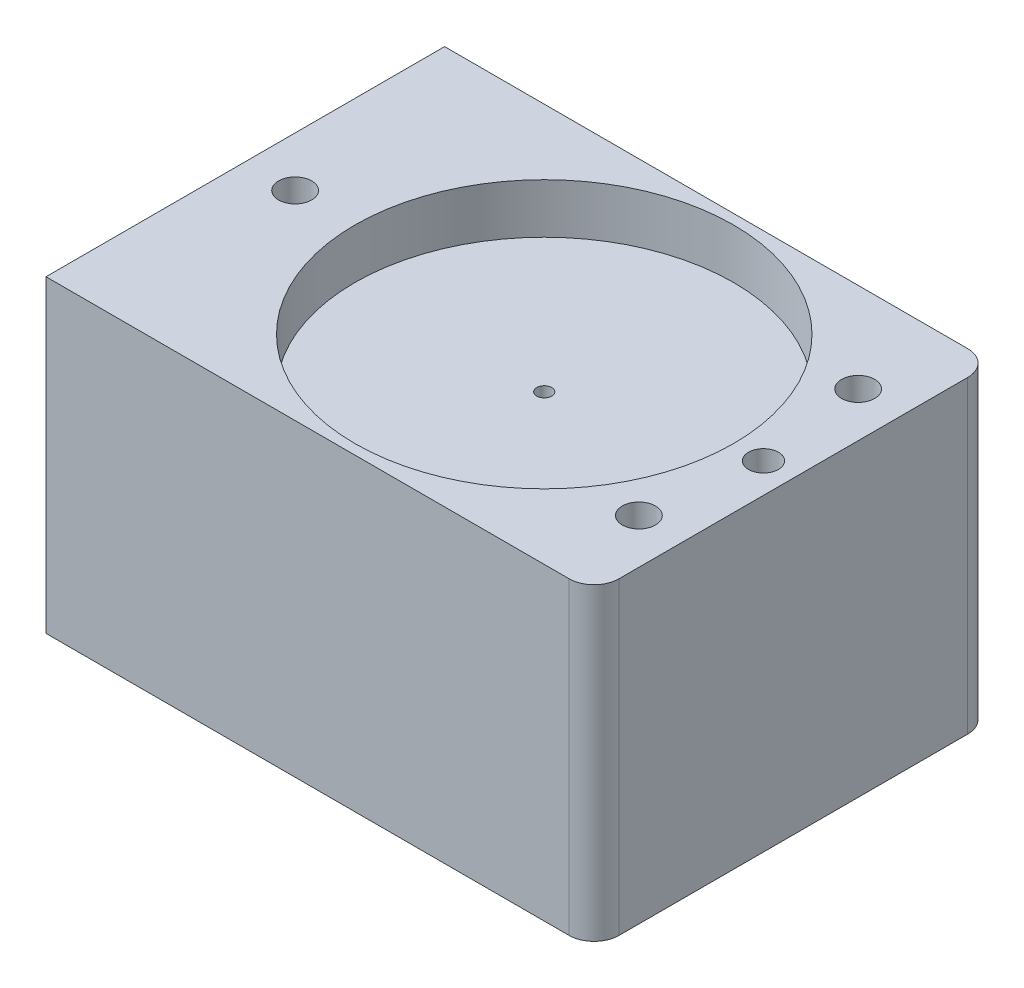
ISO-10303-21;
HEADER;
FILE_DESCRIPTION(('STEP AP214'),'2;1');
FILE_NAME('part.step','',(''),(''),'','','');
FILE_SCHEMA(('AUTOMOTIVE_DESIGN { 1 0 10303 214 1 1 1 1 }'));
ENDSEC;
DATA;
#1=APPLICATION_CONTEXT('core data for automotive mechanical design processes');
#2=APPLICATION_PROTOCOL_DEFINITION('international standard','automotive_design',2000,#1);
#3=PRODUCT_CONTEXT('',#1,'mechanical');
#4=PRODUCT('Part','Part','',(#3));
#5=PRODUCT_RELATED_PRODUCT_CATEGORY('part','',(#4));
#6=PRODUCT_DEFINITION_FORMATION('','',#4);
#7=PRODUCT_DEFINITION_CONTEXT('part definition',#1,'design');
#8=PRODUCT_DEFINITION('design','',#6,#7);
#9=PRODUCT_DEFINITION_SHAPE('','',#8);
#10=(LENGTH_UNIT() NAMED_UNIT(*) SI_UNIT(.MILLI.,.METRE.));
#11=(NAMED_UNIT(*) PLANE_ANGLE_UNIT() SI_UNIT($,.RADIAN.));
#12=(NAMED_UNIT(*) SI_UNIT($,.STERADIAN.) SOLID_ANGLE_UNIT());
#13=UNCERTAINTY_MEASURE_WITH_UNIT(LENGTH_MEASURE(1.E-05),#10,'distance_accuracy_value','');
#14=(GEOMETRIC_REPRESENTATION_CONTEXT(3) GLOBAL_UNCERTAINTY_ASSIGNED_CONTEXT((#13)) GLOBAL_UNIT_ASSIGNED_CONTEXT((#10,
#11,#12)) REPRESENTATION_CONTEXT('',''));
#15=CARTESIAN_POINT('',(0.,0.,0.));
#16=DIRECTION('',(0.,0.,1.));
#17=DIRECTION('',(1.,0.,0.));
#18=AXIS2_PLACEMENT_3D('',#15,#16,#17);
#19=CARTESIAN_POINT('',(-50.,0.,40.));
#20=DIRECTION('',(0.,1.,0.));
#21=DIRECTION('',(0.,0.,1.));
#22=AXIS2_PLACEMENT_3D('',#19,#20,#21);
#23=CYLINDRICAL_SURFACE('',#22,1.50000000000001);
#24=CARTESIAN_POINT('',(-50.,61.,40.));
#25=DIRECTION('',(0.,-1.,0.));
#26=DIRECTION('',(0.,0.,-1.));
#27=AXIS2_PLACEMENT_3D('',#24,#25,#26);
#28=CIRCLE('',#27,1.50000000000001);
#29=CARTESIAN_POINT('',(-50.,61.,38.5));
#30=VERTEX_POINT('',#29);
#31=EDGE_CURVE('E118',#30,#30,#28,.F.);
#32=ORIENTED_EDGE('',*,*,#31,.T.);
#33=EDGE_LOOP('',(#32));
#34=FACE_BOUND('',#33,.T.);
#35=CARTESIAN_POINT('',(-50.,19.,40.));
#36=DIRECTION('',(0.,-1.,0.));
#37=DIRECTION('',(0.,0.,-1.));
#38=AXIS2_PLACEMENT_3D('',#35,#36,#37);
#39=CIRCLE('',#38,1.50000000000001);
#40=CARTESIAN_POINT('',(-50.,19.,38.5));
#41=VERTEX_POINT('',#40);
#42=EDGE_CURVE('E35',#41,#41,#39,.F.);
#43=ORIENTED_EDGE('',*,*,#42,.F.);
#44=EDGE_LOOP('',(#43));
#45=FACE_BOUND('',#44,.T.);
#46=ADVANCED_FACE('F32',(#34,#45),#23,.F.);
#47=CARTESIAN_POINT('',(0.,80.,0.));
#48=DIRECTION('',(1.,0.,0.));
#49=DIRECTION('',(0.,0.,-1.));
#50=AXIS2_PLACEMENT_3D('',#47,#48,#49);
#51=PLANE('',#50);
#52=DIRECTION('',(0.,-1.,0.));
#53=VECTOR('',#52,1.);
#54=CARTESIAN_POINT('',(0.,60.,75.));
#55=LINE('',#54,#53);
#56=CARTESIAN_POINT('',(0.,9.,75.));
#57=VERTEX_POINT('',#56);
#58=CARTESIAN_POINT('',(0.,71.,75.));
#59=VERTEX_POINT('',#58);
#60=EDGE_CURVE('E105',#57,#59,#55,.F.);
#61=ORIENTED_EDGE('',*,*,#60,.F.);
#62=DIRECTION('',(0.,0.,1.));
#63=VECTOR('',#62,1.);
#64=CARTESIAN_POINT('',(0.,9.,0.));
#65=LINE('',#64,#63);
#66=CARTESIAN_POINT('',(0.,9.,5.));
#67=VERTEX_POINT('',#66);
#68=EDGE_CURVE('E98',#67,#57,#65,.T.);
#69=ORIENTED_EDGE('',*,*,#68,.F.);
#70=DIRECTION('',(0.,-1.,0.));
#71=VECTOR('',#70,1.);
#72=CARTESIAN_POINT('',(0.,60.,5.));
#73=LINE('',#72,#71);
#74=CARTESIAN_POINT('',(0.,71.,5.));
#75=VERTEX_POINT('',#74);
#76=EDGE_CURVE('E114',#75,#67,#73,.T.);
#77=ORIENTED_EDGE('',*,*,#76,.F.);
#78=DIRECTION('',(0.,0.,-1.));
#79=VECTOR('',#78,1.);
#80=CARTESIAN_POINT('',(0.,71.,0.));
#81=LINE('',#80,#79);
#82=EDGE_CURVE('E134',#59,#75,#81,.T.);
#83=ORIENTED_EDGE('',*,*,#82,.F.);
#84=EDGE_LOOP('',(#61,#69,#77,#83));
#85=FACE_BOUND('',#84,.T.);
#86=ADVANCED_FACE('F238',(#85),#51,.T.);
#87=CARTESIAN_POINT('',(-55.,40.,0.));
#88=DIRECTION('',(0.,0.,1.));
#89=DIRECTION('',(1.,0.,0.));
#90=AXIS2_PLACEMENT_3D('',#87,#88,#89);
#91=PLANE('',#90);
#92=DIRECTION('',(1.,0.,0.));
#93=VECTOR('',#92,1.);
#94=CARTESIAN_POINT('',(-110.,9.,0.));
#95=LINE('',#94,#93);
#96=CARTESIAN_POINT('',(-110.,9.,0.));
#97=VERTEX_POINT('',#96);
#98=CARTESIAN_POINT('',(-5.00000000000001,9.,0.));
#99=VERTEX_POINT('',#98);
#100=EDGE_CURVE('E87',#97,#99,#95,.T.);
#101=ORIENTED_EDGE('',*,*,#100,.F.);
#102=DIRECTION('',(0.,1.,0.));
#103=VECTOR('',#102,1.);
#104=CARTESIAN_POINT('',(-110.,0.,0.));
#105=LINE('',#104,#103);
#106=CARTESIAN_POINT('',(-110.,71.,0.));
#107=VERTEX_POINT('',#106);
#108=EDGE_CURVE('E40',#107,#97,#105,.F.);
#109=ORIENTED_EDGE('',*,*,#108,.F.);
#110=DIRECTION('',(-1.,0.,0.));
#111=VECTOR('',#110,1.);
#112=CARTESIAN_POINT('',(-110.,71.,0.));
#113=LINE('',#112,#111);
#114=CARTESIAN_POINT('',(-5.00000000000003,71.,0.));
#115=VERTEX_POINT('',#114);
#116=EDGE_CURVE('E56',#115,#107,#113,.T.);
#117=ORIENTED_EDGE('',*,*,#116,.F.);
#118=DIRECTION('',(0.,-1.,0.));
#119=VECTOR('',#118,1.);
#120=CARTESIAN_POINT('',(-5.00000000000002,60.,0.));
#121=LINE('',#120,#119);
#122=EDGE_CURVE('E97',#99,#115,#121,.F.);
#123=ORIENTED_EDGE('',*,*,#122,.F.);
#124=EDGE_LOOP('',(#101,#109,#117,#123));
#125=FACE_BOUND('',#124,.T.);
#126=ADVANCED_FACE('F96',(#125),#91,.F.);
#127=CARTESIAN_POINT('',(-55.,40.,80.));
#128=DIRECTION('',(0.,0.,1.));
#129=DIRECTION('',(1.,0.,0.));
#130=AXIS2_PLACEMENT_3D('',#127,#128,#129);
#131=PLANE('',#130);
#132=DIRECTION('',(0.,1.,0.));
#133=VECTOR('',#132,1.);
#134=CARTESIAN_POINT('',(-110.,0.,80.));
#135=LINE('',#134,#133);
#136=CARTESIAN_POINT('',(-110.,9.,80.));
#137=VERTEX_POINT('',#136);
#138=CARTESIAN_POINT('',(-110.,71.,80.));
#139=VERTEX_POINT('',#138);
#140=EDGE_CURVE('E11',#137,#139,#135,.T.);
#141=ORIENTED_EDGE('',*,*,#140,.F.);
#142=DIRECTION('',(-1.,0.,0.));
#143=VECTOR('',#142,1.);
#144=CARTESIAN_POINT('',(0.,9.,80.));
#145=LINE('',#144,#143);
#146=CARTESIAN_POINT('',(-5.00000000000001,9.,80.));
#147=VERTEX_POINT('',#146);
#148=EDGE_CURVE('E48',#147,#137,#145,.T.);
#149=ORIENTED_EDGE('',*,*,#148,.F.);
#150=DIRECTION('',(0.,-1.,0.));
#151=VECTOR('',#150,1.);
#152=CARTESIAN_POINT('',(-5.00000000000002,60.,80.));
#153=LINE('',#152,#151);
#154=CARTESIAN_POINT('',(-5.00000000000003,71.,80.));
#155=VERTEX_POINT('',#154);
#156=EDGE_CURVE('E102',#155,#147,#153,.T.);
#157=ORIENTED_EDGE('',*,*,#156,.F.);
#158=DIRECTION('',(1.,0.,0.));
#159=VECTOR('',#158,1.);
#160=CARTESIAN_POINT('',(-110.,71.,80.));
#161=LINE('',#160,#159);
#162=EDGE_CURVE('E136',#139,#155,#161,.T.);
#163=ORIENTED_EDGE('',*,*,#162,.F.);
#164=EDGE_LOOP('',(#141,#149,#157,#163));
#165=FACE_BOUND('',#164,.T.);
#166=ADVANCED_FACE('F349',(#165),#131,.T.);
#167=CARTESIAN_POINT('',(-5.00000000000002,60.,5.));
#168=DIRECTION('',(0.,-1.,0.));
#169=DIRECTION('',(1.,0.,0.));
#170=AXIS2_PLACEMENT_3D('',#167,#168,#169);
#171=CYLINDRICAL_SURFACE('',#170,5.);
#172=ORIENTED_EDGE('',*,*,#76,.T.);
#173=CARTESIAN_POINT('',(-5.00000000000001,9.,5.));
#174=DIRECTION('',(0.,-1.,0.));
#175=DIRECTION('',(0.,0.,-1.));
#176=AXIS2_PLACEMENT_3D('',#173,#174,#175);
#177=CIRCLE('',#176,5.);
#178=EDGE_CURVE('E165',#67,#99,#177,.F.);
#179=ORIENTED_EDGE('',*,*,#178,.T.);
#180=ORIENTED_EDGE('',*,*,#122,.T.);
#181=CARTESIAN_POINT('',(-5.00000000000003,71.,5.));
#182=DIRECTION('',(0.,1.,0.));
#183=DIRECTION('',(0.,0.,1.));
#184=AXIS2_PLACEMENT_3D('',#181,#182,#183);
#185=CIRCLE('',#184,5.);
#186=EDGE_CURVE('E125',#115,#75,#185,.F.);
#187=ORIENTED_EDGE('',*,*,#186,.T.);
#188=EDGE_LOOP('',(#172,#179,#180,#187));
#189=FACE_BOUND('',#188,.T.);
#190=ADVANCED_FACE('F357',(#189),#171,.T.);
#191=CARTESIAN_POINT('',(-5.00000000000002,60.,75.));
#192=DIRECTION('',(0.,-1.,0.));
#193=DIRECTION('',(1.,0.,0.));
#194=AXIS2_PLACEMENT_3D('',#191,#192,#193);
#195=CYLINDRICAL_SURFACE('',#194,5.);
#196=ORIENTED_EDGE('',*,*,#156,.T.);
#197=CARTESIAN_POINT('',(-5.00000000000001,9.,75.));
#198=DIRECTION('',(0.,-1.,0.));
#199=DIRECTION('',(0.,0.,-1.));
#200=AXIS2_PLACEMENT_3D('',#197,#198,#199);
#201=CIRCLE('',#200,5.);
#202=EDGE_CURVE('E169',#147,#57,#201,.F.);
#203=ORIENTED_EDGE('',*,*,#202,.T.);
#204=ORIENTED_EDGE('',*,*,#60,.T.);
#205=CARTESIAN_POINT('',(-5.00000000000003,71.,75.));
#206=DIRECTION('',(0.,1.,0.));
#207=DIRECTION('',(0.,0.,1.));
#208=AXIS2_PLACEMENT_3D('',#205,#206,#207);
#209=CIRCLE('',#208,5.);
#210=EDGE_CURVE('E128',#59,#155,#209,.F.);
#211=ORIENTED_EDGE('',*,*,#210,.T.);
#212=EDGE_LOOP('',(#196,#203,#204,#211));
#213=FACE_BOUND('',#212,.T.);
#214=ADVANCED_FACE('F366',(#213),#195,.T.);
#215=CARTESIAN_POINT('',(-110.,0.,0.));
#216=DIRECTION('',(-1.,0.,0.));
#217=DIRECTION('',(0.,0.,1.));
#218=AXIS2_PLACEMENT_3D('',#215,#216,#217);
#219=PLANE('',#218);
#220=ORIENTED_EDGE('',*,*,#108,.T.);
#221=DIRECTION('',(0.,0.,-1.));
#222=VECTOR('',#221,1.);
#223=CARTESIAN_POINT('',(-110.,9.,80.));
#224=LINE('',#223,#222);
#225=EDGE_CURVE('E84',#137,#97,#224,.T.);
#226=ORIENTED_EDGE('',*,*,#225,.F.);
#227=ORIENTED_EDGE('',*,*,#140,.T.);
#228=DIRECTION('',(0.,0.,1.));
#229=VECTOR('',#228,1.);
#230=CARTESIAN_POINT('',(-110.,71.,0.));
#231=LINE('',#230,#229);
#232=EDGE_CURVE('E101',#107,#139,#231,.T.);
#233=ORIENTED_EDGE('',*,*,#232,.F.);
#234=EDGE_LOOP('',(#220,#226,#227,#233));
#235=FACE_BOUND('',#234,.T.);
#236=ADVANCED_FACE('F100',(#235),#219,.T.);
#237=CARTESIAN_POINT('',(0.,71.,0.));
#238=DIRECTION('',(0.,1.,0.));
#239=DIRECTION('',(0.,0.,1.));
#240=AXIS2_PLACEMENT_3D('',#237,#238,#239);
#241=PLANE('',#240);
#242=CARTESIAN_POINT('',(-50.,71.,40.));
#243=DIRECTION('',(0.,-1.,0.));
#244=DIRECTION('',(0.,0.,-1.));
#245=AXIS2_PLACEMENT_3D('',#242,#243,#244);
#246=CIRCLE('',#245,38.0000000000006);
#247=CARTESIAN_POINT('',(-50.,71.,1.99999999999934));
#248=VERTEX_POINT('',#247);
#249=EDGE_CURVE('E162',#248,#248,#246,.T.);
#250=ORIENTED_EDGE('',*,*,#249,.T.);
#251=EDGE_LOOP('',(#250));
#252=FACE_BOUND('',#251,.T.);
#253=CARTESIAN_POINT('',(-9.00000000000002,71.,18.));
#254=DIRECTION('',(0.,1.,0.));
#255=DIRECTION('',(0.,0.,1.));
#256=AXIS2_PLACEMENT_3D('',#253,#254,#255);
#257=CIRCLE('',#256,3.3235);
#258=CARTESIAN_POINT('',(-9.00000000000002,71.,21.3235));
#259=VERTEX_POINT('',#258);
#260=EDGE_CURVE('E157',#259,#259,#257,.T.);
#261=ORIENTED_EDGE('',*,*,#260,.F.);
#262=EDGE_LOOP('',(#261));
#263=FACE_BOUND('',#262,.T.);
#264=CARTESIAN_POINT('',(-9.00000000000002,71.,62.));
#265=DIRECTION('',(0.,1.,0.));
#266=DIRECTION('',(0.,0.,1.));
#267=AXIS2_PLACEMENT_3D('',#264,#265,#266);
#268=CIRCLE('',#267,3.3235);
#269=CARTESIAN_POINT('',(-9.00000000000002,71.,65.3235));
#270=VERTEX_POINT('',#269);
#271=EDGE_CURVE('E151',#270,#270,#268,.T.);
#272=ORIENTED_EDGE('',*,*,#271,.F.);
#273=EDGE_LOOP('',(#272));
#274=FACE_BOUND('',#273,.T.);
#275=CARTESIAN_POINT('',(-6.00000000000002,71.,40.));
#276=DIRECTION('',(0.,1.,0.));
#277=DIRECTION('',(0.,0.,1.));
#278=AXIS2_PLACEMENT_3D('',#275,#276,#277);
#279=CIRCLE('',#278,2.99999999999999);
#280=CARTESIAN_POINT('',(-6.00000000000002,71.,43.));
#281=VERTEX_POINT('',#280);
#282=EDGE_CURVE('E121',#281,#281,#279,.T.);
#283=ORIENTED_EDGE('',*,*,#282,.F.);
#284=EDGE_LOOP('',(#283));
#285=FACE_BOUND('',#284,.T.);
#286=CARTESIAN_POINT('',(-100.,71.,40.));
#287=DIRECTION('',(0.,1.,0.));
#288=DIRECTION('',(0.,0.,1.));
#289=AXIS2_PLACEMENT_3D('',#286,#287,#288);
#290=CIRCLE('',#289,3.32350000000001);
#291=CARTESIAN_POINT('',(-100.,71.,43.3235));
#292=VERTEX_POINT('',#291);
#293=EDGE_CURVE('E140',#292,#292,#290,.T.);
#294=ORIENTED_EDGE('',*,*,#293,.F.);
#295=EDGE_LOOP('',(#294));
#296=FACE_BOUND('',#295,.T.);
#297=ORIENTED_EDGE('',*,*,#116,.T.);
#298=ORIENTED_EDGE('',*,*,#232,.T.);
#299=ORIENTED_EDGE('',*,*,#162,.T.);
#300=ORIENTED_EDGE('',*,*,#210,.F.);
#301=ORIENTED_EDGE('',*,*,#82,.T.);
#302=ORIENTED_EDGE('',*,*,#186,.F.);
#303=EDGE_LOOP('',(#297,#298,#299,#300,#301,#302));
#304=FACE_BOUND('',#303,.T.);
#305=ADVANCED_FACE('F381',(#252,#263,#274,#285,#296,#304),#241,.T.);
#306=CARTESIAN_POINT('',(-100.,56.,40.));
#307=DIRECTION('',(0.,1.,0.));
#308=DIRECTION('',(0.,0.,1.));
#309=AXIS2_PLACEMENT_3D('',#306,#307,#308);
#310=CYLINDRICAL_SURFACE('',#309,3.32350000000001);
#311=CARTESIAN_POINT('',(-100.,56.,40.));
#312=DIRECTION('',(0.,1.,0.));
#313=DIRECTION('',(0.,0.,1.));
#314=AXIS2_PLACEMENT_3D('',#311,#312,#313);
#315=CIRCLE('',#314,3.32350000000001);
#316=CARTESIAN_POINT('',(-100.,56.,43.3235));
#317=VERTEX_POINT('',#316);
#318=EDGE_CURVE('E139',#317,#317,#315,.T.);
#319=ORIENTED_EDGE('',*,*,#318,.F.);
#320=EDGE_LOOP('',(#319));
#321=FACE_BOUND('',#320,.T.);
#322=ORIENTED_EDGE('',*,*,#293,.T.);
#323=EDGE_LOOP('',(#322));
#324=FACE_BOUND('',#323,.T.);
#325=ADVANCED_FACE('F461',(#321,#324),#310,.F.);
#326=CARTESIAN_POINT('',(-100.,56.,40.));
#327=DIRECTION('',(0.,1.,0.));
#328=DIRECTION('',(0.,0.,1.));
#329=AXIS2_PLACEMENT_3D('',#326,#327,#328);
#330=PLANE('',#329);
#331=ORIENTED_EDGE('',*,*,#318,.T.);
#332=EDGE_LOOP('',(#331));
#333=FACE_BOUND('',#332,.T.);
#334=ADVANCED_FACE('F452',(#333),#330,.T.);
#335=CARTESIAN_POINT('',(-6.00000000000002,56.,40.));
#336=DIRECTION('',(0.,1.,0.));
#337=DIRECTION('',(0.,0.,1.));
#338=AXIS2_PLACEMENT_3D('',#335,#336,#337);
#339=CYLINDRICAL_SURFACE('',#338,2.99999999999999);
#340=CARTESIAN_POINT('',(-6.00000000000002,56.,40.));
#341=DIRECTION('',(0.,1.,0.));
#342=DIRECTION('',(0.,0.,1.));
#343=AXIS2_PLACEMENT_3D('',#340,#341,#342);
#344=CIRCLE('',#343,2.99999999999999);
#345=CARTESIAN_POINT('',(-6.00000000000002,56.,43.));
#346=VERTEX_POINT('',#345);
#347=EDGE_CURVE('E148',#346,#346,#344,.T.);
#348=ORIENTED_EDGE('',*,*,#347,.F.);
#349=EDGE_LOOP('',(#348));
#350=FACE_BOUND('',#349,.T.);
#351=ORIENTED_EDGE('',*,*,#282,.T.);
#352=EDGE_LOOP('',(#351));
#353=FACE_BOUND('',#352,.T.);
#354=ADVANCED_FACE('F443',(#350,#353),#339,.F.);
#355=CARTESIAN_POINT('',(-6.00000000000002,56.,40.));
#356=DIRECTION('',(0.,1.,0.));
#357=DIRECTION('',(0.,0.,1.));
#358=AXIS2_PLACEMENT_3D('',#355,#356,#357);
#359=PLANE('',#358);
#360=ORIENTED_EDGE('',*,*,#347,.T.);
#361=EDGE_LOOP('',(#360));
#362=FACE_BOUND('',#361,.T.);
#363=ADVANCED_FACE('F434',(#362),#359,.T.);
#364=CARTESIAN_POINT('',(-9.00000000000002,56.,62.));
#365=DIRECTION('',(0.,1.,0.));
#366=DIRECTION('',(0.,0.,1.));
#367=AXIS2_PLACEMENT_3D('',#364,#365,#366);
#368=CYLINDRICAL_SURFACE('',#367,3.3235);
#369=CARTESIAN_POINT('',(-9.00000000000002,56.,62.));
#370=DIRECTION('',(0.,1.,0.));
#371=DIRECTION('',(0.,0.,1.));
#372=AXIS2_PLACEMENT_3D('',#369,#370,#371);
#373=CIRCLE('',#372,3.3235);
#374=CARTESIAN_POINT('',(-9.00000000000002,56.,65.3235));
#375=VERTEX_POINT('',#374);
#376=EDGE_CURVE('E154',#375,#375,#373,.T.);
#377=ORIENTED_EDGE('',*,*,#376,.F.);
#378=EDGE_LOOP('',(#377));
#379=FACE_BOUND('',#378,.T.);
#380=ORIENTED_EDGE('',*,*,#271,.T.);
#381=EDGE_LOOP('',(#380));
#382=FACE_BOUND('',#381,.T.);
#383=ADVANCED_FACE('F425',(#379,#382),#368,.F.);
#384=CARTESIAN_POINT('',(-9.00000000000002,56.,62.));
#385=DIRECTION('',(0.,1.,0.));
#386=DIRECTION('',(0.,0.,1.));
#387=AXIS2_PLACEMENT_3D('',#384,#385,#386);
#388=PLANE('',#387);
#389=ORIENTED_EDGE('',*,*,#376,.T.);
#390=EDGE_LOOP('',(#389));
#391=FACE_BOUND('',#390,.T.);
#392=ADVANCED_FACE('F416',(#391),#388,.T.);
#393=CARTESIAN_POINT('',(-9.00000000000002,56.,18.));
#394=DIRECTION('',(0.,1.,0.));
#395=DIRECTION('',(0.,0.,1.));
#396=AXIS2_PLACEMENT_3D('',#393,#394,#395);
#397=CYLINDRICAL_SURFACE('',#396,3.3235);
#398=CARTESIAN_POINT('',(-9.00000000000002,56.,18.));
#399=DIRECTION('',(0.,1.,0.));
#400=DIRECTION('',(0.,0.,1.));
#401=AXIS2_PLACEMENT_3D('',#398,#399,#400);
#402=CIRCLE('',#401,3.3235);
#403=CARTESIAN_POINT('',(-9.00000000000002,56.,21.3235));
#404=VERTEX_POINT('',#403);
#405=EDGE_CURVE('E143',#404,#404,#402,.T.);
#406=ORIENTED_EDGE('',*,*,#405,.F.);
#407=EDGE_LOOP('',(#406));
#408=FACE_BOUND('',#407,.T.);
#409=ORIENTED_EDGE('',*,*,#260,.T.);
#410=EDGE_LOOP('',(#409));
#411=FACE_BOUND('',#410,.T.);
#412=ADVANCED_FACE('F407',(#408,#411),#397,.F.);
#413=CARTESIAN_POINT('',(-9.00000000000002,56.,18.));
#414=DIRECTION('',(0.,1.,0.));
#415=DIRECTION('',(0.,0.,1.));
#416=AXIS2_PLACEMENT_3D('',#413,#414,#415);
#417=PLANE('',#416);
#418=ORIENTED_EDGE('',*,*,#405,.T.);
#419=EDGE_LOOP('',(#418));
#420=FACE_BOUND('',#419,.T.);
#421=ADVANCED_FACE('F397',(#420),#417,.T.);
#422=CARTESIAN_POINT('',(-50.,61.,40.));
#423=DIRECTION('',(0.,-1.,0.));
#424=DIRECTION('',(0.,0.,-1.));
#425=AXIS2_PLACEMENT_3D('',#422,#423,#424);
#426=PLANE('',#425);
#427=CARTESIAN_POINT('',(-50.,61.,40.));
#428=DIRECTION('',(0.,-1.,0.));
#429=DIRECTION('',(0.,0.,-1.));
#430=AXIS2_PLACEMENT_3D('',#427,#428,#429);
#431=CIRCLE('',#430,38.0000000000006);
#432=CARTESIAN_POINT('',(-50.,61.,1.99999999999934));
#433=VERTEX_POINT('',#432);
#434=EDGE_CURVE('E122',#433,#433,#431,.T.);
#435=ORIENTED_EDGE('',*,*,#434,.F.);
#436=EDGE_LOOP('',(#435));
#437=FACE_BOUND('',#436,.T.);
#438=ORIENTED_EDGE('',*,*,#31,.F.);
#439=EDGE_LOOP('',(#438));
#440=FACE_BOUND('',#439,.T.);
#441=ADVANCED_FACE('F388',(#437,#440),#426,.F.);
#442=CARTESIAN_POINT('',(-50.,61.,40.));
#443=DIRECTION('',(0.,1.,0.));
#444=DIRECTION('',(0.,0.,1.));
#445=AXIS2_PLACEMENT_3D('',#442,#443,#444);
#446=CYLINDRICAL_SURFACE('',#445,38.0000000000006);
#447=ORIENTED_EDGE('',*,*,#434,.T.);
#448=EDGE_LOOP('',(#447));
#449=FACE_BOUND('',#448,.T.);
#450=ORIENTED_EDGE('',*,*,#249,.F.);
#451=EDGE_LOOP('',(#450));
#452=FACE_BOUND('',#451,.T.);
#453=ADVANCED_FACE('F217',(#449,#452),#446,.F.);
#454=CARTESIAN_POINT('',(0.,9.,0.));
#455=DIRECTION('',(0.,-1.,0.));
#456=DIRECTION('',(0.,0.,-1.));
#457=AXIS2_PLACEMENT_3D('',#454,#455,#456);
#458=PLANE('',#457);
#459=CARTESIAN_POINT('',(-8.99999999999999,9.,17.9999999999999));
#460=DIRECTION('',(0.,-1.,0.));
#461=DIRECTION('',(0.,0.,-1.));
#462=AXIS2_PLACEMENT_3D('',#459,#460,#461);
#463=CIRCLE('',#462,3.32349999999999);
#464=CARTESIAN_POINT('',(-8.99999999999999,9.,14.6765));
#465=VERTEX_POINT('',#464);
#466=EDGE_CURVE('E193',#465,#465,#463,.T.);
#467=ORIENTED_EDGE('',*,*,#466,.F.);
#468=EDGE_LOOP('',(#467));
#469=FACE_BOUND('',#468,.T.);
#470=CARTESIAN_POINT('',(-5.99999999999998,9.,39.9999999999999));
#471=DIRECTION('',(0.,-1.,0.));
#472=DIRECTION('',(0.,0.,-1.));
#473=AXIS2_PLACEMENT_3D('',#470,#471,#472);
#474=CIRCLE('',#473,2.99999999999999);
#475=CARTESIAN_POINT('',(-5.99999999999998,9.,37.));
#476=VERTEX_POINT('',#475);
#477=EDGE_CURVE('E199',#476,#476,#474,.T.);
#478=ORIENTED_EDGE('',*,*,#477,.F.);
#479=EDGE_LOOP('',(#478));
#480=FACE_BOUND('',#479,.T.);
#481=CARTESIAN_POINT('',(-50.,9.,40.));
#482=DIRECTION('',(0.,-1.,0.));
#483=DIRECTION('',(0.,0.,-1.));
#484=AXIS2_PLACEMENT_3D('',#481,#482,#483);
#485=CIRCLE('',#484,38.0000000000006);
#486=CARTESIAN_POINT('',(-50.,9.,1.99999999999934));
#487=VERTEX_POINT('',#486);
#488=EDGE_CURVE('E180',#487,#487,#485,.T.);
#489=ORIENTED_EDGE('',*,*,#488,.F.);
#490=EDGE_LOOP('',(#489));
#491=FACE_BOUND('',#490,.T.);
#492=CARTESIAN_POINT('',(-8.99999999999997,9.,61.9999999999999));
#493=DIRECTION('',(0.,-1.,0.));
#494=DIRECTION('',(0.,0.,-1.));
#495=AXIS2_PLACEMENT_3D('',#492,#493,#494);
#496=CIRCLE('',#495,3.3235);
#497=CARTESIAN_POINT('',(-8.99999999999997,9.,58.6764999999999));
#498=VERTEX_POINT('',#497);
#499=EDGE_CURVE('E187',#498,#498,#496,.T.);
#500=ORIENTED_EDGE('',*,*,#499,.F.);
#501=EDGE_LOOP('',(#500));
#502=FACE_BOUND('',#501,.T.);
#503=CARTESIAN_POINT('',(-100.,9.,40.));
#504=DIRECTION('',(0.,-1.,0.));
#505=DIRECTION('',(0.,0.,-1.));
#506=AXIS2_PLACEMENT_3D('',#503,#504,#505);
#507=CIRCLE('',#506,3.32350000000002);
#508=CARTESIAN_POINT('',(-100.,9.,36.6765));
#509=VERTEX_POINT('',#508);
#510=EDGE_CURVE('E175',#509,#509,#507,.T.);
#511=ORIENTED_EDGE('',*,*,#510,.F.);
#512=EDGE_LOOP('',(#511));
#513=FACE_BOUND('',#512,.T.);
#514=ORIENTED_EDGE('',*,*,#68,.T.);
#515=ORIENTED_EDGE('',*,*,#202,.F.);
#516=ORIENTED_EDGE('',*,*,#148,.T.);
#517=ORIENTED_EDGE('',*,*,#225,.T.);
#518=ORIENTED_EDGE('',*,*,#100,.T.);
#519=ORIENTED_EDGE('',*,*,#178,.F.);
#520=EDGE_LOOP('',(#514,#515,#516,#517,#518,#519));
#521=FACE_BOUND('',#520,.T.);
#522=ADVANCED_FACE('F86',(#469,#480,#491,#502,#513,#521),#458,.T.);
#523=CARTESIAN_POINT('',(-100.,19.,40.));
#524=DIRECTION('',(0.,-1.,0.));
#525=DIRECTION('',(0.,0.,-1.));
#526=AXIS2_PLACEMENT_3D('',#523,#524,#525);
#527=CYLINDRICAL_SURFACE('',#526,3.32350000000002);
#528=CARTESIAN_POINT('',(-100.,19.,40.));
#529=DIRECTION('',(0.,-1.,0.));
#530=DIRECTION('',(0.,0.,-1.));
#531=AXIS2_PLACEMENT_3D('',#528,#529,#530);
#532=CIRCLE('',#531,3.32350000000002);
#533=CARTESIAN_POINT('',(-100.,19.,36.6765));
#534=VERTEX_POINT('',#533);
#535=EDGE_CURVE('E174',#534,#534,#532,.T.);
#536=ORIENTED_EDGE('',*,*,#535,.F.);
#537=EDGE_LOOP('',(#536));
#538=FACE_BOUND('',#537,.T.);
#539=ORIENTED_EDGE('',*,*,#510,.T.);
#540=EDGE_LOOP('',(#539));
#541=FACE_BOUND('',#540,.T.);
#542=ADVANCED_FACE('F216',(#538,#541),#527,.F.);
#543=CARTESIAN_POINT('',(-100.,19.,40.));
#544=DIRECTION('',(0.,-1.,0.));
#545=DIRECTION('',(0.,0.,-1.));
#546=AXIS2_PLACEMENT_3D('',#543,#544,#545);
#547=PLANE('',#546);
#548=ORIENTED_EDGE('',*,*,#535,.T.);
#549=EDGE_LOOP('',(#548));
#550=FACE_BOUND('',#549,.T.);
#551=ADVANCED_FACE('F227',(#550),#547,.T.);
#552=CARTESIAN_POINT('',(-8.99999999999997,19.,61.9999999999999));
#553=DIRECTION('',(0.,-1.,0.));
#554=DIRECTION('',(0.,0.,-1.));
#555=AXIS2_PLACEMENT_3D('',#552,#553,#554);
#556=CYLINDRICAL_SURFACE('',#555,3.3235);
#557=CARTESIAN_POINT('',(-8.99999999999997,19.,61.9999999999999));
#558=DIRECTION('',(0.,-1.,0.));
#559=DIRECTION('',(0.,0.,-1.));
#560=AXIS2_PLACEMENT_3D('',#557,#558,#559);
#561=CIRCLE('',#560,3.3235);
#562=CARTESIAN_POINT('',(-8.99999999999997,19.,58.6764999999999));
#563=VERTEX_POINT('',#562);
#564=EDGE_CURVE('E184',#563,#563,#561,.T.);
#565=ORIENTED_EDGE('',*,*,#564,.F.);
#566=EDGE_LOOP('',(#565));
#567=FACE_BOUND('',#566,.T.);
#568=ORIENTED_EDGE('',*,*,#499,.T.);
#569=EDGE_LOOP('',(#568));
#570=FACE_BOUND('',#569,.T.);
#571=ADVANCED_FACE('F233',(#567,#570),#556,.F.);
#572=CARTESIAN_POINT('',(-8.99999999999997,19.,61.9999999999999));
#573=DIRECTION('',(0.,-1.,0.));
#574=DIRECTION('',(0.,0.,-1.));
#575=AXIS2_PLACEMENT_3D('',#572,#573,#574);
#576=PLANE('',#575);
#577=ORIENTED_EDGE('',*,*,#564,.T.);
#578=EDGE_LOOP('',(#577));
#579=FACE_BOUND('',#578,.T.);
#580=ADVANCED_FACE('F251',(#579),#576,.T.);
#581=CARTESIAN_POINT('',(-50.,19.,40.));
#582=DIRECTION('',(0.,-1.,0.));
#583=DIRECTION('',(0.,0.,-1.));
#584=AXIS2_PLACEMENT_3D('',#581,#582,#583);
#585=PLANE('',#584);
#586=CARTESIAN_POINT('',(-50.,19.,40.));
#587=DIRECTION('',(0.,-1.,0.));
#588=DIRECTION('',(0.,0.,-1.));
#589=AXIS2_PLACEMENT_3D('',#586,#587,#588);
#590=CIRCLE('',#589,38.0000000000006);
#591=CARTESIAN_POINT('',(-50.,19.,1.99999999999934));
#592=VERTEX_POINT('',#591);
#593=EDGE_CURVE('E183',#592,#592,#590,.T.);
#594=ORIENTED_EDGE('',*,*,#593,.T.);
#595=EDGE_LOOP('',(#594));
#596=FACE_BOUND('',#595,.T.);
#597=ORIENTED_EDGE('',*,*,#42,.T.);
#598=EDGE_LOOP('',(#597));
#599=FACE_BOUND('',#598,.T.);
#600=ADVANCED_FACE('F249',(#596,#599),#585,.T.);
#601=CARTESIAN_POINT('',(-50.,19.,40.));
#602=DIRECTION('',(0.,-1.,0.));
#603=DIRECTION('',(0.,0.,-1.));
#604=AXIS2_PLACEMENT_3D('',#601,#602,#603);
#605=CYLINDRICAL_SURFACE('',#604,38.0000000000006);
#606=ORIENTED_EDGE('',*,*,#593,.F.);
#607=EDGE_LOOP('',(#606));
#608=FACE_BOUND('',#607,.T.);
#609=ORIENTED_EDGE('',*,*,#488,.T.);
#610=EDGE_LOOP('',(#609));
#611=FACE_BOUND('',#610,.T.);
#612=ADVANCED_FACE('F210',(#608,#611),#605,.F.);
#613=CARTESIAN_POINT('',(-5.99999999999998,19.,39.9999999999999));
#614=DIRECTION('',(0.,-1.,0.));
#615=DIRECTION('',(0.,0.,-1.));
#616=AXIS2_PLACEMENT_3D('',#613,#614,#615);
#617=CYLINDRICAL_SURFACE('',#616,2.99999999999999);
#618=CARTESIAN_POINT('',(-5.99999999999998,19.,39.9999999999999));
#619=DIRECTION('',(0.,-1.,0.));
#620=DIRECTION('',(0.,0.,-1.));
#621=AXIS2_PLACEMENT_3D('',#618,#619,#620);
#622=CIRCLE('',#621,2.99999999999999);
#623=CARTESIAN_POINT('',(-5.99999999999998,19.,37.));
#624=VERTEX_POINT('',#623);
#625=EDGE_CURVE('E190',#624,#624,#622,.T.);
#626=ORIENTED_EDGE('',*,*,#625,.F.);
#627=EDGE_LOOP('',(#626));
#628=FACE_BOUND('',#627,.T.);
#629=ORIENTED_EDGE('',*,*,#477,.T.);
#630=EDGE_LOOP('',(#629));
#631=FACE_BOUND('',#630,.T.);
#632=ADVANCED_FACE('F207',(#628,#631),#617,.F.);
#633=CARTESIAN_POINT('',(-5.99999999999998,19.,39.9999999999999));
#634=DIRECTION('',(0.,-1.,0.));
#635=DIRECTION('',(0.,0.,-1.));
#636=AXIS2_PLACEMENT_3D('',#633,#634,#635);
#637=PLANE('',#636);
#638=ORIENTED_EDGE('',*,*,#625,.T.);
#639=EDGE_LOOP('',(#638));
#640=FACE_BOUND('',#639,.T.);
#641=ADVANCED_FACE('F205',(#640),#637,.T.);
#642=CARTESIAN_POINT('',(-8.99999999999999,19.,17.9999999999999));
#643=DIRECTION('',(0.,-1.,0.));
#644=DIRECTION('',(0.,0.,-1.));
#645=AXIS2_PLACEMENT_3D('',#642,#643,#644);
#646=CYLINDRICAL_SURFACE('',#645,3.32349999999999);
#647=CARTESIAN_POINT('',(-8.99999999999999,19.,17.9999999999999));
#648=DIRECTION('',(0.,-1.,0.));
#649=DIRECTION('',(0.,0.,-1.));
#650=AXIS2_PLACEMENT_3D('',#647,#648,#649);
#651=CIRCLE('',#650,3.32349999999999);
#652=CARTESIAN_POINT('',(-8.99999999999999,19.,14.6765));
#653=VERTEX_POINT('',#652);
#654=EDGE_CURVE('E196',#653,#653,#651,.T.);
#655=ORIENTED_EDGE('',*,*,#654,.F.);
#656=EDGE_LOOP('',(#655));
#657=FACE_BOUND('',#656,.T.);
#658=ORIENTED_EDGE('',*,*,#466,.T.);
#659=EDGE_LOOP('',(#658));
#660=FACE_BOUND('',#659,.T.);
#661=ADVANCED_FACE('F266',(#657,#660),#646,.F.);
#662=CARTESIAN_POINT('',(-8.99999999999999,19.,17.9999999999999));
#663=DIRECTION('',(0.,-1.,0.));
#664=DIRECTION('',(0.,0.,-1.));
#665=AXIS2_PLACEMENT_3D('',#662,#663,#664);
#666=PLANE('',#665);
#667=ORIENTED_EDGE('',*,*,#654,.T.);
#668=EDGE_LOOP('',(#667));
#669=FACE_BOUND('',#668,.T.);
#670=ADVANCED_FACE('F269',(#669),#666,.T.);
#671=CLOSED_SHELL('',(#46,#86,#126,#166,#190,#214,#236,#305,#325,#334,#354,#363,#383,#392,#412,
#421,#441,#453,#522,#542,#551,#571,#580,#600,#612,#632,#641,#661,#670));
#672=MANIFOLD_SOLID_BREP('B2',#671);
#673=ADVANCED_BREP_SHAPE_REPRESENTATION('',(#18,#672),#14);
#674=SHAPE_DEFINITION_REPRESENTATION(#9,#673);
ENDSEC;
END-ISO-10303-21;
